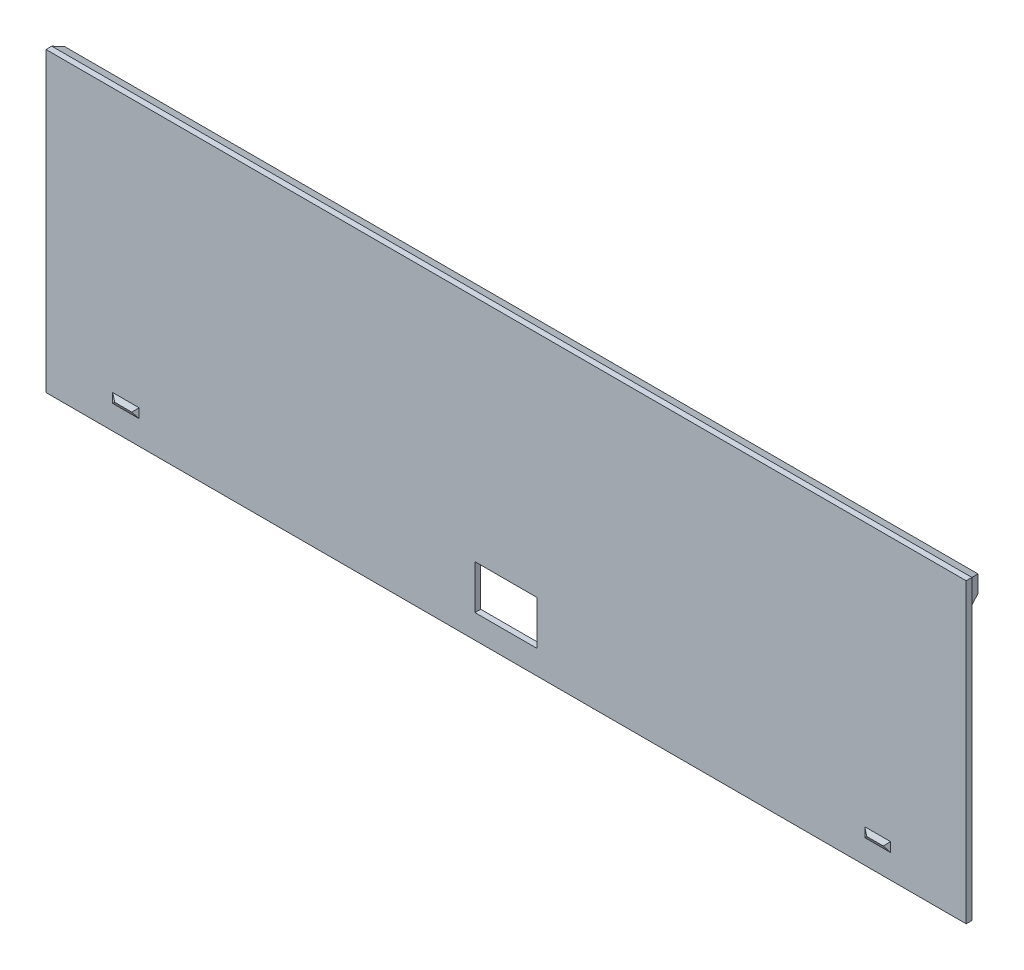
ISO-10303-21;
HEADER;
FILE_DESCRIPTION(('STEP AP214'),'2;1');
FILE_NAME('part.step','',(''),(''),'','','');
FILE_SCHEMA(('AUTOMOTIVE_DESIGN { 1 0 10303 214 1 1 1 1 }'));
ENDSEC;
DATA;
#1=APPLICATION_CONTEXT('core data for automotive mechanical design processes');
#2=APPLICATION_PROTOCOL_DEFINITION('international standard','automotive_design',2000,#1);
#3=PRODUCT_CONTEXT('',#1,'mechanical');
#4=PRODUCT('Part','Part','',(#3));
#5=PRODUCT_RELATED_PRODUCT_CATEGORY('part','',(#4));
#6=PRODUCT_DEFINITION_FORMATION('','',#4);
#7=PRODUCT_DEFINITION_CONTEXT('part definition',#1,'design');
#8=PRODUCT_DEFINITION('design','',#6,#7);
#9=PRODUCT_DEFINITION_SHAPE('','',#8);
#10=(LENGTH_UNIT() NAMED_UNIT(*) SI_UNIT(.MILLI.,.METRE.));
#11=(NAMED_UNIT(*) PLANE_ANGLE_UNIT() SI_UNIT($,.RADIAN.));
#12=(NAMED_UNIT(*) SI_UNIT($,.STERADIAN.) SOLID_ANGLE_UNIT());
#13=UNCERTAINTY_MEASURE_WITH_UNIT(LENGTH_MEASURE(1.E-05),#10,'distance_accuracy_value','');
#14=(GEOMETRIC_REPRESENTATION_CONTEXT(3) GLOBAL_UNCERTAINTY_ASSIGNED_CONTEXT((#13)) GLOBAL_UNIT_ASSIGNED_CONTEXT((#10,
#11,#12)) REPRESENTATION_CONTEXT('',''));
#15=CARTESIAN_POINT('',(0.,0.,0.));
#16=DIRECTION('',(0.,0.,1.));
#17=DIRECTION('',(1.,0.,0.));
#18=AXIS2_PLACEMENT_3D('',#15,#16,#17);
#19=CARTESIAN_POINT('',(0.,0.,1.2));
#20=DIRECTION('',(0.,0.,-1.));
#21=DIRECTION('',(-1.,0.,0.));
#22=AXIS2_PLACEMENT_3D('',#19,#20,#21);
#23=PLANE('',#22);
#24=DIRECTION('',(0.,-1.,0.));
#25=VECTOR('',#24,1.);
#26=CARTESIAN_POINT('',(-82.0836118270731,-26.,1.2));
#27=LINE('',#26,#25);
#28=CARTESIAN_POINT('',(-82.0836118270731,-24.0296583846095,1.2));
#29=VERTEX_POINT('',#28);
#30=CARTESIAN_POINT('',(-82.0836118270731,-26.,1.2));
#31=VERTEX_POINT('',#30);
#32=EDGE_CURVE('E191',#29,#31,#27,.T.);
#33=ORIENTED_EDGE('',*,*,#32,.F.);
#34=DIRECTION('',(-1.,0.,0.));
#35=VECTOR('',#34,1.);
#36=CARTESIAN_POINT('',(-82.0836118270731,-24.0296583846095,1.2));
#37=LINE('',#36,#35);
#38=CARTESIAN_POINT('',(-76.5546638801718,-24.0296583846095,1.2));
#39=VERTEX_POINT('',#38);
#40=EDGE_CURVE('E203',#39,#29,#37,.T.);
#41=ORIENTED_EDGE('',*,*,#40,.F.);
#42=DIRECTION('',(0.,1.,0.));
#43=VECTOR('',#42,1.);
#44=CARTESIAN_POINT('',(-76.5546638801718,-26.,1.2));
#45=LINE('',#44,#43);
#46=CARTESIAN_POINT('',(-76.5546638801718,-26.,1.2));
#47=VERTEX_POINT('',#46);
#48=EDGE_CURVE('E199',#47,#39,#45,.T.);
#49=ORIENTED_EDGE('',*,*,#48,.F.);
#50=DIRECTION('',(1.,0.,0.));
#51=VECTOR('',#50,1.);
#52=CARTESIAN_POINT('',(-82.0836118270731,-26.,1.2));
#53=LINE('',#52,#51);
#54=EDGE_CURVE('E195',#31,#47,#53,.T.);
#55=ORIENTED_EDGE('',*,*,#54,.F.);
#56=EDGE_LOOP('',(#33,#41,#49,#55));
#57=FACE_BOUND('',#56,.T.);
#58=DIRECTION('',(-1.,0.,0.));
#59=VECTOR('',#58,1.);
#60=CARTESIAN_POINT('',(-6.49999999999999,-16.8,1.2));
#61=LINE('',#60,#59);
#62=CARTESIAN_POINT('',(6.50000000000001,-16.8,1.2));
#63=VERTEX_POINT('',#62);
#64=CARTESIAN_POINT('',(-6.49999999999999,-16.8,1.2));
#65=VERTEX_POINT('',#64);
#66=EDGE_CURVE('E229',#63,#65,#61,.T.);
#67=ORIENTED_EDGE('',*,*,#66,.F.);
#68=DIRECTION('',(0.,1.,0.));
#69=VECTOR('',#68,1.);
#70=CARTESIAN_POINT('',(6.50000000000001,-16.8,1.2));
#71=LINE('',#70,#69);
#72=CARTESIAN_POINT('',(6.50000000000001,-26.,1.2));
#73=VERTEX_POINT('',#72);
#74=EDGE_CURVE('E226',#73,#63,#71,.T.);
#75=ORIENTED_EDGE('',*,*,#74,.F.);
#76=DIRECTION('',(1.,0.,0.));
#77=VECTOR('',#76,1.);
#78=CARTESIAN_POINT('',(-6.49999999999999,-26.,1.2));
#79=LINE('',#78,#77);
#80=CARTESIAN_POINT('',(-6.49999999999999,-26.,1.2));
#81=VERTEX_POINT('',#80);
#82=EDGE_CURVE('E237',#81,#73,#79,.T.);
#83=ORIENTED_EDGE('',*,*,#82,.F.);
#84=DIRECTION('',(0.,-1.,0.));
#85=VECTOR('',#84,1.);
#86=CARTESIAN_POINT('',(-6.49999999999999,-16.8,1.2));
#87=LINE('',#86,#85);
#88=EDGE_CURVE('E233',#65,#81,#87,.T.);
#89=ORIENTED_EDGE('',*,*,#88,.F.);
#90=EDGE_LOOP('',(#67,#75,#83,#89));
#91=FACE_BOUND('',#90,.T.);
#92=DIRECTION('',(0.,1.,0.));
#93=VECTOR('',#92,1.);
#94=CARTESIAN_POINT('',(96.,-31.,1.2));
#95=LINE('',#94,#93);
#96=CARTESIAN_POINT('',(96.,-31.,1.2));
#97=VERTEX_POINT('',#96);
#98=CARTESIAN_POINT('',(96.,31.,1.2));
#99=VERTEX_POINT('',#98);
#100=EDGE_CURVE('E305',#97,#99,#95,.T.);
#101=ORIENTED_EDGE('',*,*,#100,.T.);
#102=DIRECTION('',(-1.,0.,0.));
#103=VECTOR('',#102,1.);
#104=CARTESIAN_POINT('',(-96.,31.,1.2));
#105=LINE('',#104,#103);
#106=CARTESIAN_POINT('',(-96.,31.,1.2));
#107=VERTEX_POINT('',#106);
#108=EDGE_CURVE('E309',#99,#107,#105,.T.);
#109=ORIENTED_EDGE('',*,*,#108,.T.);
#110=DIRECTION('',(0.,-1.,0.));
#111=VECTOR('',#110,1.);
#112=CARTESIAN_POINT('',(-96.,-31.,1.2));
#113=LINE('',#112,#111);
#114=CARTESIAN_POINT('',(-96.,-31.,1.2));
#115=VERTEX_POINT('',#114);
#116=EDGE_CURVE('E313',#107,#115,#113,.T.);
#117=ORIENTED_EDGE('',*,*,#116,.T.);
#118=DIRECTION('',(1.,0.,0.));
#119=VECTOR('',#118,1.);
#120=CARTESIAN_POINT('',(-96.,-31.,1.2));
#121=LINE('',#120,#119);
#122=EDGE_CURVE('E316',#115,#97,#121,.T.);
#123=ORIENTED_EDGE('',*,*,#122,.T.);
#124=EDGE_LOOP('',(#101,#109,#117,#123));
#125=FACE_BOUND('',#124,.T.);
#126=DIRECTION('',(0.,-1.,0.));
#127=VECTOR('',#126,1.);
#128=CARTESIAN_POINT('',(74.853449127279,-26.,1.2));
#129=LINE('',#128,#127);
#130=CARTESIAN_POINT('',(74.853449127279,-24.0296583846095,1.2));
#131=VERTEX_POINT('',#130);
#132=CARTESIAN_POINT('',(74.853449127279,-26.,1.2));
#133=VERTEX_POINT('',#132);
#134=EDGE_CURVE('E156',#131,#133,#129,.T.);
#135=ORIENTED_EDGE('',*,*,#134,.F.);
#136=DIRECTION('',(-1.,0.,0.));
#137=VECTOR('',#136,1.);
#138=CARTESIAN_POINT('',(74.853449127279,-24.0296583846095,1.2));
#139=LINE('',#138,#137);
#140=CARTESIAN_POINT('',(80.2406291781059,-24.0296583846095,1.2));
#141=VERTEX_POINT('',#140);
#142=EDGE_CURVE('E159',#141,#131,#139,.T.);
#143=ORIENTED_EDGE('',*,*,#142,.F.);
#144=DIRECTION('',(0.,1.,0.));
#145=VECTOR('',#144,1.);
#146=CARTESIAN_POINT('',(80.2406291781059,-26.,1.2));
#147=LINE('',#146,#145);
#148=CARTESIAN_POINT('',(80.2406291781059,-26.,1.2));
#149=VERTEX_POINT('',#148);
#150=EDGE_CURVE('E60',#149,#141,#147,.T.);
#151=ORIENTED_EDGE('',*,*,#150,.F.);
#152=DIRECTION('',(1.,0.,0.));
#153=VECTOR('',#152,1.);
#154=CARTESIAN_POINT('',(74.853449127279,-26.,1.2));
#155=LINE('',#154,#153);
#156=EDGE_CURVE('E55',#133,#149,#155,.T.);
#157=ORIENTED_EDGE('',*,*,#156,.F.);
#158=EDGE_LOOP('',(#135,#143,#151,#157));
#159=FACE_BOUND('',#158,.T.);
#160=ADVANCED_FACE('F39',(#57,#91,#125,#159),#23,.F.);
#161=CARTESIAN_POINT('',(0.,0.,0.));
#162=DIRECTION('',(0.,0.,-1.));
#163=DIRECTION('',(-1.,0.,0.));
#164=AXIS2_PLACEMENT_3D('',#161,#162,#163);
#165=PLANE('',#164);
#166=DIRECTION('',(0.,-1.,0.));
#167=VECTOR('',#166,1.);
#168=CARTESIAN_POINT('',(6.50000000000002,0.,0.));
#169=LINE('',#168,#167);
#170=CARTESIAN_POINT('',(6.50000000000001,-16.8,0.));
#171=VERTEX_POINT('',#170);
#172=CARTESIAN_POINT('',(6.50000000000001,-26.,0.));
#173=VERTEX_POINT('',#172);
#174=EDGE_CURVE('E264',#171,#173,#169,.T.);
#175=ORIENTED_EDGE('',*,*,#174,.F.);
#176=DIRECTION('',(1.,0.,0.));
#177=VECTOR('',#176,1.);
#178=CARTESIAN_POINT('',(0.,-16.8,0.));
#179=LINE('',#178,#177);
#180=CARTESIAN_POINT('',(-6.49999999999999,-16.8,0.));
#181=VERTEX_POINT('',#180);
#182=EDGE_CURVE('E245',#181,#171,#179,.T.);
#183=ORIENTED_EDGE('',*,*,#182,.F.);
#184=DIRECTION('',(0.,1.,0.));
#185=VECTOR('',#184,1.);
#186=CARTESIAN_POINT('',(-6.49999999999999,0.,0.));
#187=LINE('',#186,#185);
#188=CARTESIAN_POINT('',(-6.49999999999999,-26.,0.));
#189=VERTEX_POINT('',#188);
#190=EDGE_CURVE('E257',#189,#181,#187,.T.);
#191=ORIENTED_EDGE('',*,*,#190,.F.);
#192=DIRECTION('',(-1.,0.,0.));
#193=VECTOR('',#192,1.);
#194=CARTESIAN_POINT('',(0.,-26.,0.));
#195=LINE('',#194,#193);
#196=EDGE_CURVE('E261',#173,#189,#195,.T.);
#197=ORIENTED_EDGE('',*,*,#196,.F.);
#198=EDGE_LOOP('',(#175,#183,#191,#197));
#199=FACE_BOUND('',#198,.T.);
#200=DIRECTION('',(0.,-1.,0.));
#201=VECTOR('',#200,1.);
#202=CARTESIAN_POINT('',(-96.,-31.,0.));
#203=LINE('',#202,#201);
#204=CARTESIAN_POINT('',(-96.,26.,0.));
#205=VERTEX_POINT('',#204);
#206=CARTESIAN_POINT('',(-96.,-31.,0.));
#207=VERTEX_POINT('',#206);
#208=EDGE_CURVE('E327',#205,#207,#203,.T.);
#209=ORIENTED_EDGE('',*,*,#208,.F.);
#210=DIRECTION('',(1.,0.,0.));
#211=VECTOR('',#210,1.);
#212=CARTESIAN_POINT('',(-96.,26.,0.));
#213=LINE('',#212,#211);
#214=CARTESIAN_POINT('',(96.,26.,0.));
#215=VERTEX_POINT('',#214);
#216=EDGE_CURVE('E267',#205,#215,#213,.T.);
#217=ORIENTED_EDGE('',*,*,#216,.T.);
#218=DIRECTION('',(0.,1.,0.));
#219=VECTOR('',#218,1.);
#220=CARTESIAN_POINT('',(96.,-31.,0.));
#221=LINE('',#220,#219);
#222=CARTESIAN_POINT('',(96.,-31.,0.));
#223=VERTEX_POINT('',#222);
#224=EDGE_CURVE('E279',#223,#215,#221,.T.);
#225=ORIENTED_EDGE('',*,*,#224,.F.);
#226=DIRECTION('',(1.,0.,0.));
#227=VECTOR('',#226,1.);
#228=CARTESIAN_POINT('',(-96.,-31.,0.));
#229=LINE('',#228,#227);
#230=EDGE_CURVE('E310',#207,#223,#229,.T.);
#231=ORIENTED_EDGE('',*,*,#230,.F.);
#232=EDGE_LOOP('',(#209,#217,#225,#231));
#233=FACE_BOUND('',#232,.T.);
#234=ADVANCED_FACE('F366',(#199,#233),#165,.T.);
#235=CARTESIAN_POINT('',(96.,-31.,1.2));
#236=DIRECTION('',(-1.,0.,0.));
#237=DIRECTION('',(0.,0.,1.));
#238=AXIS2_PLACEMENT_3D('',#235,#236,#237);
#239=PLANE('',#238);
#240=ORIENTED_EDGE('',*,*,#224,.T.);
#241=DIRECTION('',(0.,1.,0.));
#242=VECTOR('',#241,1.);
#243=CARTESIAN_POINT('',(96.,26.,0.));
#244=LINE('',#243,#242);
#245=CARTESIAN_POINT('',(96.,31.,0.));
#246=VERTEX_POINT('',#245);
#247=EDGE_CURVE('E271',#215,#246,#244,.T.);
#248=ORIENTED_EDGE('',*,*,#247,.T.);
#249=DIRECTION('',(0.,0.,-1.));
#250=VECTOR('',#249,1.);
#251=CARTESIAN_POINT('',(96.,31.,1.2));
#252=LINE('',#251,#250);
#253=EDGE_CURVE('E11',#99,#246,#252,.T.);
#254=ORIENTED_EDGE('',*,*,#253,.F.);
#255=ORIENTED_EDGE('',*,*,#100,.F.);
#256=DIRECTION('',(0.,0.,-1.));
#257=VECTOR('',#256,1.);
#258=CARTESIAN_POINT('',(96.,-31.,1.2));
#259=LINE('',#258,#257);
#260=EDGE_CURVE('E319',#97,#223,#259,.T.);
#261=ORIENTED_EDGE('',*,*,#260,.T.);
#262=EDGE_LOOP('',(#240,#248,#254,#255,#261));
#263=FACE_BOUND('',#262,.T.);
#264=ADVANCED_FACE('F41',(#263),#239,.F.);
#265=CARTESIAN_POINT('',(-96.,31.,1.2));
#266=DIRECTION('',(0.,-1.,0.));
#267=DIRECTION('',(0.,0.,-1.));
#268=AXIS2_PLACEMENT_3D('',#265,#266,#267);
#269=PLANE('',#268);
#270=DIRECTION('',(-1.,0.,0.));
#271=VECTOR('',#270,1.);
#272=CARTESIAN_POINT('',(-96.,31.,0.));
#273=LINE('',#272,#271);
#274=CARTESIAN_POINT('',(-96.,31.,0.));
#275=VERTEX_POINT('',#274);
#276=EDGE_CURVE('E323',#246,#275,#273,.T.);
#277=ORIENTED_EDGE('',*,*,#276,.T.);
#278=DIRECTION('',(0.,0.,-1.));
#279=VECTOR('',#278,1.);
#280=CARTESIAN_POINT('',(-96.,31.,1.2));
#281=LINE('',#280,#279);
#282=EDGE_CURVE('E48',#107,#275,#281,.T.);
#283=ORIENTED_EDGE('',*,*,#282,.F.);
#284=ORIENTED_EDGE('',*,*,#108,.F.);
#285=ORIENTED_EDGE('',*,*,#253,.T.);
#286=EDGE_LOOP('',(#277,#283,#284,#285));
#287=FACE_BOUND('',#286,.T.);
#288=ADVANCED_FACE('F349',(#287),#269,.F.);
#289=CARTESIAN_POINT('',(-96.,-31.,1.2));
#290=DIRECTION('',(1.,0.,0.));
#291=DIRECTION('',(0.,0.,-1.));
#292=AXIS2_PLACEMENT_3D('',#289,#290,#291);
#293=PLANE('',#292);
#294=EDGE_CURVE('E328',#275,#205,#203,.T.);
#295=ORIENTED_EDGE('',*,*,#294,.T.);
#296=ORIENTED_EDGE('',*,*,#208,.T.);
#297=DIRECTION('',(0.,0.,-1.));
#298=VECTOR('',#297,1.);
#299=CARTESIAN_POINT('',(-96.,-31.,1.2));
#300=LINE('',#299,#298);
#301=EDGE_CURVE('E337',#115,#207,#300,.T.);
#302=ORIENTED_EDGE('',*,*,#301,.F.);
#303=ORIENTED_EDGE('',*,*,#116,.F.);
#304=ORIENTED_EDGE('',*,*,#282,.T.);
#305=EDGE_LOOP('',(#295,#296,#302,#303,#304));
#306=FACE_BOUND('',#305,.T.);
#307=ADVANCED_FACE('F345',(#306),#293,.F.);
#308=CARTESIAN_POINT('',(-96.,-31.,1.2));
#309=DIRECTION('',(0.,1.,0.));
#310=DIRECTION('',(0.,0.,1.));
#311=AXIS2_PLACEMENT_3D('',#308,#309,#310);
#312=PLANE('',#311);
#313=ORIENTED_EDGE('',*,*,#230,.T.);
#314=ORIENTED_EDGE('',*,*,#260,.F.);
#315=ORIENTED_EDGE('',*,*,#122,.F.);
#316=ORIENTED_EDGE('',*,*,#301,.T.);
#317=EDGE_LOOP('',(#313,#314,#315,#316));
#318=FACE_BOUND('',#317,.T.);
#319=ADVANCED_FACE('F371',(#318),#312,.F.);
#320=CARTESIAN_POINT('',(-96.,31.,0.));
#321=DIRECTION('',(-0.939692620785908,0.,-0.342020143325669));
#322=DIRECTION('',(-0.342020143325669,0.,0.939692620785908));
#323=AXIS2_PLACEMENT_3D('',#320,#321,#322);
#324=PLANE('',#323);
#325=ORIENTED_EDGE('',*,*,#294,.F.);
#326=DIRECTION('',(-0.323615577118185,0.323615577118185,0.889126490715988));
#327=VECTOR('',#326,1.);
#328=CARTESIAN_POINT('',(-75.8924079833211,10.8924079833211,-55.2451550254313));
#329=LINE('',#328,#327);
#330=CARTESIAN_POINT('',(-95.2720595314676,30.2720595314676,-2.));
#331=VERTEX_POINT('',#330);
#332=EDGE_CURVE('E276',#331,#275,#329,.T.);
#333=ORIENTED_EDGE('',*,*,#332,.F.);
#334=DIRECTION('',(0.,-1.,0.));
#335=VECTOR('',#334,1.);
#336=CARTESIAN_POINT('',(-95.2720595314676,0.,-2.));
#337=LINE('',#336,#335);
#338=CARTESIAN_POINT('',(-95.2720595314676,26.7279404685324,-2.));
#339=VERTEX_POINT('',#338);
#340=EDGE_CURVE('E275',#331,#339,#337,.T.);
#341=ORIENTED_EDGE('',*,*,#340,.T.);
#342=DIRECTION('',(-0.323615577118185,-0.323615577118185,0.889126490715988));
#343=VECTOR('',#342,1.);
#344=CARTESIAN_POINT('',(-95.4763647912323,26.5236352087677,-1.43867591212061));
#345=LINE('',#344,#343);
#346=EDGE_CURVE('E281',#339,#205,#345,.T.);
#347=ORIENTED_EDGE('',*,*,#346,.T.);
#348=EDGE_LOOP('',(#325,#333,#341,#347));
#349=FACE_BOUND('',#348,.T.);
#350=ADVANCED_FACE('F388',(#349),#324,.T.);
#351=CARTESIAN_POINT('',(96.,31.,0.));
#352=DIRECTION('',(0.,0.939692620785908,-0.342020143325669));
#353=DIRECTION('',(0.,0.342020143325669,0.939692620785908));
#354=AXIS2_PLACEMENT_3D('',#351,#352,#353);
#355=PLANE('',#354);
#356=ORIENTED_EDGE('',*,*,#276,.F.);
#357=DIRECTION('',(0.323615577118185,0.323615577118185,0.889126490715988));
#358=VECTOR('',#357,1.);
#359=CARTESIAN_POINT('',(95.4763647912323,30.4763647912323,-1.43867591212061));
#360=LINE('',#359,#358);
#361=CARTESIAN_POINT('',(95.2720595314676,30.2720595314676,-2.));
#362=VERTEX_POINT('',#361);
#363=EDGE_CURVE('E280',#362,#246,#360,.T.);
#364=ORIENTED_EDGE('',*,*,#363,.F.);
#365=DIRECTION('',(-1.,0.,0.));
#366=VECTOR('',#365,1.);
#367=CARTESIAN_POINT('',(0.,30.2720595314676,-2.));
#368=LINE('',#367,#366);
#369=EDGE_CURVE('E285',#362,#331,#368,.T.);
#370=ORIENTED_EDGE('',*,*,#369,.T.);
#371=ORIENTED_EDGE('',*,*,#332,.T.);
#372=EDGE_LOOP('',(#356,#364,#370,#371));
#373=FACE_BOUND('',#372,.T.);
#374=ADVANCED_FACE('F353',(#373),#355,.T.);
#375=CARTESIAN_POINT('',(96.,26.,0.));
#376=DIRECTION('',(0.939692620785908,0.,-0.342020143325669));
#377=DIRECTION('',(-0.342020143325669,0.,-0.939692620785908));
#378=AXIS2_PLACEMENT_3D('',#375,#376,#377);
#379=PLANE('',#378);
#380=ORIENTED_EDGE('',*,*,#247,.F.);
#381=DIRECTION('',(0.323615577118185,-0.323615577118185,0.889126490715988));
#382=VECTOR('',#381,1.);
#383=CARTESIAN_POINT('',(75.8924079833211,46.1075920166789,-55.2451550254313));
#384=LINE('',#383,#382);
#385=CARTESIAN_POINT('',(95.2720595314676,26.7279404685324,-2.));
#386=VERTEX_POINT('',#385);
#387=EDGE_CURVE('E284',#386,#215,#384,.T.);
#388=ORIENTED_EDGE('',*,*,#387,.F.);
#389=DIRECTION('',(0.,1.,0.));
#390=VECTOR('',#389,1.);
#391=CARTESIAN_POINT('',(95.2720595314676,0.,-2.));
#392=LINE('',#391,#390);
#393=EDGE_CURVE('E298',#386,#362,#392,.T.);
#394=ORIENTED_EDGE('',*,*,#393,.T.);
#395=ORIENTED_EDGE('',*,*,#363,.T.);
#396=EDGE_LOOP('',(#380,#388,#394,#395));
#397=FACE_BOUND('',#396,.T.);
#398=ADVANCED_FACE('F358',(#397),#379,.T.);
#399=CARTESIAN_POINT('',(-96.,26.,0.));
#400=DIRECTION('',(0.,-0.939692620785908,-0.342020143325669));
#401=DIRECTION('',(0.,0.342020143325669,-0.939692620785908));
#402=AXIS2_PLACEMENT_3D('',#399,#400,#401);
#403=PLANE('',#402);
#404=ORIENTED_EDGE('',*,*,#216,.F.);
#405=ORIENTED_EDGE('',*,*,#346,.F.);
#406=DIRECTION('',(1.,0.,0.));
#407=VECTOR('',#406,1.);
#408=CARTESIAN_POINT('',(0.,26.7279404685324,-2.));
#409=LINE('',#408,#407);
#410=EDGE_CURVE('E294',#339,#386,#409,.T.);
#411=ORIENTED_EDGE('',*,*,#410,.T.);
#412=ORIENTED_EDGE('',*,*,#387,.T.);
#413=EDGE_LOOP('',(#404,#405,#411,#412));
#414=FACE_BOUND('',#413,.T.);
#415=ADVANCED_FACE('F362',(#414),#403,.T.);
#416=CARTESIAN_POINT('',(0.,0.,-2.));
#417=DIRECTION('',(0.,0.,1.));
#418=DIRECTION('',(1.,0.,0.));
#419=AXIS2_PLACEMENT_3D('',#416,#417,#418);
#420=PLANE('',#419);
#421=ORIENTED_EDGE('',*,*,#340,.F.);
#422=ORIENTED_EDGE('',*,*,#369,.F.);
#423=ORIENTED_EDGE('',*,*,#393,.F.);
#424=ORIENTED_EDGE('',*,*,#410,.F.);
#425=EDGE_LOOP('',(#421,#422,#423,#424));
#426=FACE_BOUND('',#425,.T.);
#427=ADVANCED_FACE('F409',(#426),#420,.F.);
#428=CARTESIAN_POINT('',(6.50000000000001,-16.8,-0.8));
#429=DIRECTION('',(1.,0.,0.));
#430=DIRECTION('',(0.,1.,0.));
#431=AXIS2_PLACEMENT_3D('',#428,#429,#430);
#432=PLANE('',#431);
#433=ORIENTED_EDGE('',*,*,#174,.T.);
#434=DIRECTION('',(0.,0.,1.));
#435=VECTOR('',#434,1.);
#436=CARTESIAN_POINT('',(6.50000000000001,-26.,-0.8));
#437=LINE('',#436,#435);
#438=EDGE_CURVE('E242',#173,#73,#437,.T.);
#439=ORIENTED_EDGE('',*,*,#438,.T.);
#440=ORIENTED_EDGE('',*,*,#74,.T.);
#441=DIRECTION('',(0.,0.,1.));
#442=VECTOR('',#441,1.);
#443=CARTESIAN_POINT('',(6.50000000000001,-16.8,-0.8));
#444=LINE('',#443,#442);
#445=EDGE_CURVE('E241',#171,#63,#444,.T.);
#446=ORIENTED_EDGE('',*,*,#445,.F.);
#447=EDGE_LOOP('',(#433,#439,#440,#446));
#448=FACE_BOUND('',#447,.T.);
#449=ADVANCED_FACE('F414',(#448),#432,.F.);
#450=CARTESIAN_POINT('',(-6.49999999999999,-26.,-0.8));
#451=DIRECTION('',(0.,-1.,0.));
#452=DIRECTION('',(0.,0.,-1.));
#453=AXIS2_PLACEMENT_3D('',#450,#451,#452);
#454=PLANE('',#453);
#455=ORIENTED_EDGE('',*,*,#196,.T.);
#456=DIRECTION('',(0.,0.,1.));
#457=VECTOR('',#456,1.);
#458=CARTESIAN_POINT('',(-6.49999999999999,-26.,-0.8));
#459=LINE('',#458,#457);
#460=EDGE_CURVE('E246',#189,#81,#459,.T.);
#461=ORIENTED_EDGE('',*,*,#460,.T.);
#462=ORIENTED_EDGE('',*,*,#82,.T.);
#463=ORIENTED_EDGE('',*,*,#438,.F.);
#464=EDGE_LOOP('',(#455,#461,#462,#463));
#465=FACE_BOUND('',#464,.T.);
#466=ADVANCED_FACE('F419',(#465),#454,.F.);
#467=CARTESIAN_POINT('',(-6.49999999999999,-16.8,-0.8));
#468=DIRECTION('',(-1.,0.,0.));
#469=DIRECTION('',(0.,0.,1.));
#470=AXIS2_PLACEMENT_3D('',#467,#468,#469);
#471=PLANE('',#470);
#472=ORIENTED_EDGE('',*,*,#190,.T.);
#473=DIRECTION('',(0.,0.,1.));
#474=VECTOR('',#473,1.);
#475=CARTESIAN_POINT('',(-6.49999999999999,-16.8,-0.8));
#476=LINE('',#475,#474);
#477=EDGE_CURVE('E249',#181,#65,#476,.T.);
#478=ORIENTED_EDGE('',*,*,#477,.T.);
#479=ORIENTED_EDGE('',*,*,#88,.T.);
#480=ORIENTED_EDGE('',*,*,#460,.F.);
#481=EDGE_LOOP('',(#472,#478,#479,#480));
#482=FACE_BOUND('',#481,.T.);
#483=ADVANCED_FACE('F429',(#482),#471,.F.);
#484=CARTESIAN_POINT('',(-6.49999999999999,-16.8,-0.8));
#485=DIRECTION('',(0.,1.,0.));
#486=DIRECTION('',(-1.,0.,0.));
#487=AXIS2_PLACEMENT_3D('',#484,#485,#486);
#488=PLANE('',#487);
#489=ORIENTED_EDGE('',*,*,#182,.T.);
#490=ORIENTED_EDGE('',*,*,#445,.T.);
#491=ORIENTED_EDGE('',*,*,#66,.T.);
#492=ORIENTED_EDGE('',*,*,#477,.F.);
#493=EDGE_LOOP('',(#489,#490,#491,#492));
#494=FACE_BOUND('',#493,.T.);
#495=ADVANCED_FACE('F439',(#494),#488,.F.);
#496=CARTESIAN_POINT('',(-82.0836118270731,-26.,1.2));
#497=DIRECTION('',(-0.499999999999998,0.,0.86602540378444));
#498=DIRECTION('',(0.86602540378444,0.,0.499999999999998));
#499=AXIS2_PLACEMENT_3D('',#496,#497,#498);
#500=PLANE('',#499);
#501=ORIENTED_EDGE('',*,*,#32,.T.);
#502=DIRECTION('',(-0.654653670707978,-0.654653670707978,-0.377964473009225));
#503=VECTOR('',#502,1.);
#504=CARTESIAN_POINT('',(-82.0836118270731,-26.,1.2));
#505=LINE('',#504,#503);
#506=CARTESIAN_POINT('',(-81.0984410193778,-25.0148291923047,1.76878863102062));
#507=VERTEX_POINT('',#506);
#508=EDGE_CURVE('E208',#507,#31,#505,.T.);
#509=ORIENTED_EDGE('',*,*,#508,.F.);
#510=DIRECTION('',(-0.654653670707978,0.654653670707978,-0.377964473009225));
#511=VECTOR('',#510,1.);
#512=CARTESIAN_POINT('',(-81.2391797061914,-24.8740905054911,1.68753311230339));
#513=LINE('',#512,#511);
#514=EDGE_CURVE('E207',#507,#29,#513,.T.);
#515=ORIENTED_EDGE('',*,*,#514,.T.);
#516=EDGE_LOOP('',(#501,#509,#515));
#517=FACE_BOUND('',#516,.T.);
#518=ADVANCED_FACE('F448',(#517),#500,.T.);
#519=CARTESIAN_POINT('',(-82.0836118270731,-26.,1.2));
#520=DIRECTION('',(0.,-0.499999999999998,0.86602540378444));
#521=DIRECTION('',(0.,-0.86602540378444,-0.499999999999998));
#522=AXIS2_PLACEMENT_3D('',#519,#520,#521);
#523=PLANE('',#522);
#524=DIRECTION('',(1.,0.,0.));
#525=VECTOR('',#524,1.);
#526=CARTESIAN_POINT('',(-82.0836118270731,-25.0148291923047,1.76878863102062));
#527=LINE('',#526,#525);
#528=CARTESIAN_POINT('',(-77.539834687867,-25.0148291923047,1.76878863102062));
#529=VERTEX_POINT('',#528);
#530=EDGE_CURVE('E212',#507,#529,#527,.T.);
#531=ORIENTED_EDGE('',*,*,#530,.F.);
#532=ORIENTED_EDGE('',*,*,#508,.T.);
#533=ORIENTED_EDGE('',*,*,#54,.T.);
#534=DIRECTION('',(0.654653670707978,-0.654653670707978,-0.377964473009225));
#535=VECTOR('',#534,1.);
#536=CARTESIAN_POINT('',(-76.5546638801718,-26.,1.2));
#537=LINE('',#536,#535);
#538=EDGE_CURVE('E213',#529,#47,#537,.T.);
#539=ORIENTED_EDGE('',*,*,#538,.F.);
#540=EDGE_LOOP('',(#531,#532,#533,#539));
#541=FACE_BOUND('',#540,.T.);
#542=ADVANCED_FACE('F463',(#541),#523,.T.);
#543=CARTESIAN_POINT('',(-76.5546638801718,-26.,1.2));
#544=DIRECTION('',(0.499999999999998,0.,0.86602540378444));
#545=DIRECTION('',(0.86602540378444,0.,-0.499999999999998));
#546=AXIS2_PLACEMENT_3D('',#543,#544,#545);
#547=PLANE('',#546);
#548=ORIENTED_EDGE('',*,*,#48,.T.);
#549=DIRECTION('',(0.654653670707978,0.654653670707978,-0.377964473009225));
#550=VECTOR('',#549,1.);
#551=CARTESIAN_POINT('',(-78.9242130002723,-26.39920750471,2.56805982234809));
#552=LINE('',#551,#550);
#553=EDGE_CURVE('E217',#529,#39,#552,.T.);
#554=ORIENTED_EDGE('',*,*,#553,.F.);
#555=ORIENTED_EDGE('',*,*,#538,.T.);
#556=EDGE_LOOP('',(#548,#554,#555));
#557=FACE_BOUND('',#556,.T.);
#558=ADVANCED_FACE('F473',(#557),#547,.T.);
#559=CARTESIAN_POINT('',(-82.0836118270731,-24.0296583846095,1.2));
#560=DIRECTION('',(0.,0.499999999999998,0.86602540378444));
#561=DIRECTION('',(0.,-0.86602540378444,0.499999999999998));
#562=AXIS2_PLACEMENT_3D('',#559,#560,#561);
#563=PLANE('',#562);
#564=ORIENTED_EDGE('',*,*,#514,.F.);
#565=ORIENTED_EDGE('',*,*,#530,.T.);
#566=ORIENTED_EDGE('',*,*,#553,.T.);
#567=ORIENTED_EDGE('',*,*,#40,.T.);
#568=EDGE_LOOP('',(#564,#565,#566,#567));
#569=FACE_BOUND('',#568,.T.);
#570=ADVANCED_FACE('F483',(#569),#563,.T.);
#571=CARTESIAN_POINT('',(74.853449127279,-26.,1.2));
#572=DIRECTION('',(-0.499999999999998,0.,0.86602540378444));
#573=DIRECTION('',(0.86602540378444,0.,0.499999999999998));
#574=AXIS2_PLACEMENT_3D('',#571,#572,#573);
#575=PLANE('',#574);
#576=ORIENTED_EDGE('',*,*,#134,.T.);
#577=DIRECTION('',(-0.654653670707978,-0.654653670707978,-0.377964473009225));
#578=VECTOR('',#577,1.);
#579=CARTESIAN_POINT('',(74.853449127279,-26.,1.2));
#580=LINE('',#579,#578);
#581=CARTESIAN_POINT('',(75.8386199349743,-25.0148291923047,1.76878863102062));
#582=VERTEX_POINT('',#581);
#583=EDGE_CURVE('E168',#582,#133,#580,.T.);
#584=ORIENTED_EDGE('',*,*,#583,.F.);
#585=DIRECTION('',(-0.654653670707978,0.654653670707978,-0.377964473009225));
#586=VECTOR('',#585,1.);
#587=CARTESIAN_POINT('',(75.6978812481607,-24.8740905054911,1.68753311230339));
#588=LINE('',#587,#586);
#589=EDGE_CURVE('E166',#582,#131,#588,.T.);
#590=ORIENTED_EDGE('',*,*,#589,.T.);
#591=EDGE_LOOP('',(#576,#584,#590));
#592=FACE_BOUND('',#591,.T.);
#593=ADVANCED_FACE('F167',(#592),#575,.T.);
#594=CARTESIAN_POINT('',(74.853449127279,-26.,1.2));
#595=DIRECTION('',(0.,-0.499999999999998,0.86602540378444));
#596=DIRECTION('',(0.,-0.86602540378444,-0.499999999999998));
#597=AXIS2_PLACEMENT_3D('',#594,#595,#596);
#598=PLANE('',#597);
#599=DIRECTION('',(1.,0.,0.));
#600=VECTOR('',#599,1.);
#601=CARTESIAN_POINT('',(74.853449127279,-25.0148291923047,1.76878863102062));
#602=LINE('',#601,#600);
#603=CARTESIAN_POINT('',(79.2554583704107,-25.0148291923047,1.76878863102063));
#604=VERTEX_POINT('',#603);
#605=EDGE_CURVE('E182',#582,#604,#602,.T.);
#606=ORIENTED_EDGE('',*,*,#605,.F.);
#607=ORIENTED_EDGE('',*,*,#583,.T.);
#608=ORIENTED_EDGE('',*,*,#156,.T.);
#609=DIRECTION('',(0.654653670707978,-0.654653670707978,-0.377964473009225));
#610=VECTOR('',#609,1.);
#611=CARTESIAN_POINT('',(80.2406291781059,-26.,1.2));
#612=LINE('',#611,#610);
#613=EDGE_CURVE('E183',#604,#149,#612,.T.);
#614=ORIENTED_EDGE('',*,*,#613,.F.);
#615=EDGE_LOOP('',(#606,#607,#608,#614));
#616=FACE_BOUND('',#615,.T.);
#617=ADVANCED_FACE('F502',(#616),#598,.T.);
#618=CARTESIAN_POINT('',(80.2406291781059,-26.,1.2));
#619=DIRECTION('',(0.499999999999998,0.,0.86602540378444));
#620=DIRECTION('',(0.86602540378444,0.,-0.499999999999998));
#621=AXIS2_PLACEMENT_3D('',#618,#619,#620);
#622=PLANE('',#621);
#623=ORIENTED_EDGE('',*,*,#150,.T.);
#624=DIRECTION('',(0.654653670707978,0.654653670707978,-0.377964473009225));
#625=VECTOR('',#624,1.);
#626=CARTESIAN_POINT('',(77.9318377277515,-26.3384498349638,2.5329813653648));
#627=LINE('',#626,#625);
#628=EDGE_CURVE('E171',#604,#141,#627,.T.);
#629=ORIENTED_EDGE('',*,*,#628,.F.);
#630=ORIENTED_EDGE('',*,*,#613,.T.);
#631=EDGE_LOOP('',(#623,#629,#630));
#632=FACE_BOUND('',#631,.T.);
#633=ADVANCED_FACE('F511',(#632),#622,.T.);
#634=CARTESIAN_POINT('',(74.853449127279,-24.0296583846095,1.2));
#635=DIRECTION('',(0.,0.499999999999998,0.86602540378444));
#636=DIRECTION('',(0.,-0.86602540378444,0.499999999999998));
#637=AXIS2_PLACEMENT_3D('',#634,#635,#636);
#638=PLANE('',#637);
#639=ORIENTED_EDGE('',*,*,#589,.F.);
#640=ORIENTED_EDGE('',*,*,#605,.T.);
#641=ORIENTED_EDGE('',*,*,#628,.T.);
#642=ORIENTED_EDGE('',*,*,#142,.T.);
#643=EDGE_LOOP('',(#639,#640,#641,#642));
#644=FACE_BOUND('',#643,.T.);
#645=ADVANCED_FACE('F173',(#644),#638,.T.);
#646=CLOSED_SHELL('',(#160,#234,#264,#288,#307,#319,#350,#374,#398,#415,#427,#449,#466,#483,
#495,#518,#542,#558,#570,#593,#617,#633,#645));
#647=MANIFOLD_SOLID_BREP('B2',#646);
#648=ADVANCED_BREP_SHAPE_REPRESENTATION('',(#18,#647),#14);
#649=SHAPE_DEFINITION_REPRESENTATION(#9,#648);
ENDSEC;
END-ISO-10303-21;
